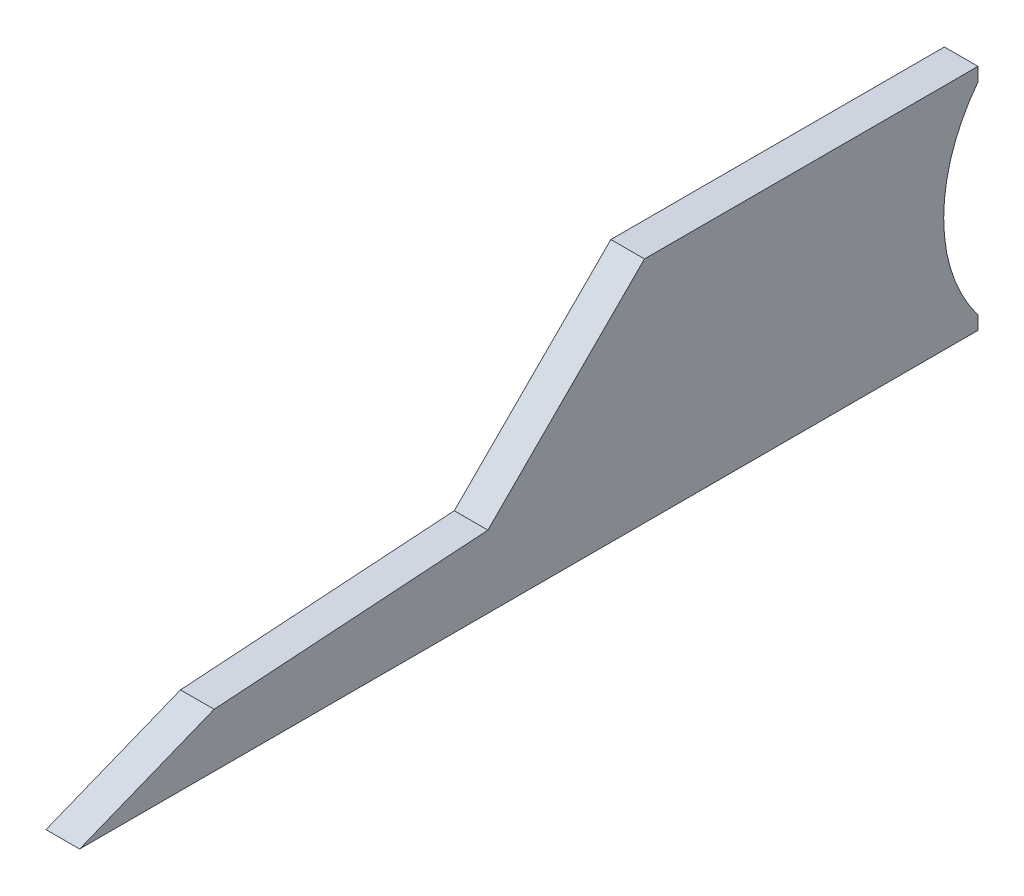
ISO-10303-21;
HEADER;
FILE_DESCRIPTION(('STEP AP214'),'2;1');
FILE_NAME('part.step','',(''),(''),'','','');
FILE_SCHEMA(('AUTOMOTIVE_DESIGN { 1 0 10303 214 1 1 1 1 }'));
ENDSEC;
DATA;
#1=APPLICATION_CONTEXT('core data for automotive mechanical design processes');
#2=APPLICATION_PROTOCOL_DEFINITION('international standard','automotive_design',2000,#1);
#3=PRODUCT_CONTEXT('',#1,'mechanical');
#4=PRODUCT('Part','Part','',(#3));
#5=PRODUCT_RELATED_PRODUCT_CATEGORY('part','',(#4));
#6=PRODUCT_DEFINITION_FORMATION('','',#4);
#7=PRODUCT_DEFINITION_CONTEXT('part definition',#1,'design');
#8=PRODUCT_DEFINITION('design','',#6,#7);
#9=PRODUCT_DEFINITION_SHAPE('','',#8);
#10=(LENGTH_UNIT() NAMED_UNIT(*) SI_UNIT(.MILLI.,.METRE.));
#11=(NAMED_UNIT(*) PLANE_ANGLE_UNIT() SI_UNIT($,.RADIAN.));
#12=(NAMED_UNIT(*) SI_UNIT($,.STERADIAN.) SOLID_ANGLE_UNIT());
#13=UNCERTAINTY_MEASURE_WITH_UNIT(LENGTH_MEASURE(1.E-05),#10,'distance_accuracy_value','');
#14=(GEOMETRIC_REPRESENTATION_CONTEXT(3) GLOBAL_UNCERTAINTY_ASSIGNED_CONTEXT((#13)) GLOBAL_UNIT_ASSIGNED_CONTEXT((#10,
#11,#12)) REPRESENTATION_CONTEXT('',''));
#15=CARTESIAN_POINT('',(0.,0.,0.));
#16=DIRECTION('',(0.,0.,1.));
#17=DIRECTION('',(1.,0.,0.));
#18=AXIS2_PLACEMENT_3D('',#15,#16,#17);
#19=CARTESIAN_POINT('',(6.35,0.,0.));
#20=DIRECTION('',(0.,0.,1.));
#21=DIRECTION('',(0.,-1.,0.));
#22=AXIS2_PLACEMENT_3D('',#19,#20,#21);
#23=PLANE('',#22);
#24=DIRECTION('',(0.,1.,0.));
#25=VECTOR('',#24,1.);
#26=CARTESIAN_POINT('',(0.,0.,0.));
#27=LINE('',#26,#25);
#28=CARTESIAN_POINT('',(0.,0.,0.));
#29=VERTEX_POINT('',#28);
#30=CARTESIAN_POINT('',(0.,2.54,0.));
#31=VERTEX_POINT('',#30);
#32=EDGE_CURVE('E125',#29,#31,#27,.T.);
#33=ORIENTED_EDGE('',*,*,#32,.T.);
#34=DIRECTION('',(-1.,0.,0.));
#35=VECTOR('',#34,1.);
#36=CARTESIAN_POINT('',(6.35,2.54,0.));
#37=LINE('',#36,#35);
#38=CARTESIAN_POINT('',(6.35,2.54,0.));
#39=VERTEX_POINT('',#38);
#40=EDGE_CURVE('E11',#39,#31,#37,.T.);
#41=ORIENTED_EDGE('',*,*,#40,.F.);
#42=DIRECTION('',(0.,1.,0.));
#43=VECTOR('',#42,1.);
#44=CARTESIAN_POINT('',(6.35,0.,0.));
#45=LINE('',#44,#43);
#46=CARTESIAN_POINT('',(6.35,0.,0.));
#47=VERTEX_POINT('',#46);
#48=EDGE_CURVE('E126',#47,#39,#45,.T.);
#49=ORIENTED_EDGE('',*,*,#48,.F.);
#50=DIRECTION('',(-1.,0.,0.));
#51=VECTOR('',#50,1.);
#52=CARTESIAN_POINT('',(6.35,0.,0.));
#53=LINE('',#52,#51);
#54=EDGE_CURVE('E139',#47,#29,#53,.T.);
#55=ORIENTED_EDGE('',*,*,#54,.T.);
#56=EDGE_LOOP('',(#33,#41,#49,#55));
#57=FACE_BOUND('',#56,.T.);
#58=ADVANCED_FACE('F33',(#57),#23,.F.);
#59=CARTESIAN_POINT('',(6.35,21.59,-24.7620690573304));
#60=DIRECTION('',(-1.,0.,0.));
#61=DIRECTION('',(0.,0.,1.));
#62=AXIS2_PLACEMENT_3D('',#59,#60,#61);
#63=CYLINDRICAL_SURFACE('',#62,31.242);
#64=CARTESIAN_POINT('',(0.,21.59,-24.7620690573304));
#65=DIRECTION('',(-1.,0.,0.));
#66=DIRECTION('',(0.,0.,-1.));
#67=AXIS2_PLACEMENT_3D('',#64,#65,#66);
#68=CIRCLE('',#67,31.242);
#69=CARTESIAN_POINT('',(0.,40.64,0.));
#70=VERTEX_POINT('',#69);
#71=EDGE_CURVE('E142',#31,#70,#68,.T.);
#72=ORIENTED_EDGE('',*,*,#71,.T.);
#73=DIRECTION('',(-1.,0.,0.));
#74=VECTOR('',#73,1.);
#75=CARTESIAN_POINT('',(6.35,40.64,0.));
#76=LINE('',#75,#74);
#77=CARTESIAN_POINT('',(6.35,40.64,0.));
#78=VERTEX_POINT('',#77);
#79=EDGE_CURVE('E40',#78,#70,#76,.T.);
#80=ORIENTED_EDGE('',*,*,#79,.F.);
#81=CARTESIAN_POINT('',(6.35,21.59,-24.7620690573304));
#82=DIRECTION('',(-1.,0.,0.));
#83=DIRECTION('',(0.,0.,-1.));
#84=AXIS2_PLACEMENT_3D('',#81,#82,#83);
#85=CIRCLE('',#84,31.242);
#86=EDGE_CURVE('E129',#39,#78,#85,.T.);
#87=ORIENTED_EDGE('',*,*,#86,.F.);
#88=ORIENTED_EDGE('',*,*,#40,.T.);
#89=EDGE_LOOP('',(#72,#80,#87,#88));
#90=FACE_BOUND('',#89,.T.);
#91=ADVANCED_FACE('F184',(#90),#63,.F.);
#92=CARTESIAN_POINT('',(6.35,40.64,0.));
#93=DIRECTION('',(0.,0.,1.));
#94=DIRECTION('',(1.,0.,0.));
#95=AXIS2_PLACEMENT_3D('',#92,#93,#94);
#96=PLANE('',#95);
#97=DIRECTION('',(0.,1.,0.));
#98=VECTOR('',#97,1.);
#99=CARTESIAN_POINT('',(0.,40.64,0.));
#100=LINE('',#99,#98);
#101=CARTESIAN_POINT('',(0.,43.18,0.));
#102=VERTEX_POINT('',#101);
#103=EDGE_CURVE('E144',#70,#102,#100,.T.);
#104=ORIENTED_EDGE('',*,*,#103,.T.);
#105=DIRECTION('',(-1.,0.,0.));
#106=VECTOR('',#105,1.);
#107=CARTESIAN_POINT('',(6.35,43.18,0.));
#108=LINE('',#107,#106);
#109=CARTESIAN_POINT('',(6.35,43.18,0.));
#110=VERTEX_POINT('',#109);
#111=EDGE_CURVE('E154',#110,#102,#108,.T.);
#112=ORIENTED_EDGE('',*,*,#111,.F.);
#113=DIRECTION('',(0.,1.,0.));
#114=VECTOR('',#113,1.);
#115=CARTESIAN_POINT('',(6.35,40.64,0.));
#116=LINE('',#115,#114);
#117=EDGE_CURVE('E132',#78,#110,#116,.T.);
#118=ORIENTED_EDGE('',*,*,#117,.F.);
#119=ORIENTED_EDGE('',*,*,#79,.T.);
#120=EDGE_LOOP('',(#104,#112,#118,#119));
#121=FACE_BOUND('',#120,.T.);
#122=ADVANCED_FACE('F161',(#121),#96,.F.);
#123=CARTESIAN_POINT('',(6.35,43.18,0.));
#124=DIRECTION('',(0.,-1.,0.));
#125=DIRECTION('',(0.,0.,-1.));
#126=AXIS2_PLACEMENT_3D('',#123,#124,#125);
#127=PLANE('',#126);
#128=DIRECTION('',(0.,0.,1.));
#129=VECTOR('',#128,1.);
#130=CARTESIAN_POINT('',(0.,43.18,0.));
#131=LINE('',#130,#129);
#132=CARTESIAN_POINT('',(0.,43.18,62.9919999999995));
#133=VERTEX_POINT('',#132);
#134=EDGE_CURVE('E146',#102,#133,#131,.T.);
#135=ORIENTED_EDGE('',*,*,#134,.T.);
#136=DIRECTION('',(-1.,0.,0.));
#137=VECTOR('',#136,1.);
#138=CARTESIAN_POINT('',(6.35,43.18,62.9919999999995));
#139=LINE('',#138,#137);
#140=CARTESIAN_POINT('',(6.35,43.18,62.9919999999995));
#141=VERTEX_POINT('',#140);
#142=EDGE_CURVE('E152',#141,#133,#139,.T.);
#143=ORIENTED_EDGE('',*,*,#142,.F.);
#144=DIRECTION('',(0.,0.,1.));
#145=VECTOR('',#144,1.);
#146=CARTESIAN_POINT('',(6.35,43.18,0.));
#147=LINE('',#146,#145);
#148=EDGE_CURVE('E134',#110,#141,#147,.T.);
#149=ORIENTED_EDGE('',*,*,#148,.F.);
#150=ORIENTED_EDGE('',*,*,#111,.T.);
#151=EDGE_LOOP('',(#135,#143,#149,#150));
#152=FACE_BOUND('',#151,.T.);
#153=ADVANCED_FACE('F170',(#152),#127,.F.);
#154=CARTESIAN_POINT('',(6.35,0.,106.172));
#155=DIRECTION('',(0.,-0.707106781186551,-0.707106781186544));
#156=DIRECTION('',(0.,0.707106781186544,-0.707106781186551));
#157=AXIS2_PLACEMENT_3D('',#154,#155,#156);
#158=PLANE('',#157);
#159=DIRECTION('',(0.,-0.707106781186544,0.707106781186551));
#160=VECTOR('',#159,1.);
#161=CARTESIAN_POINT('',(0.,0.,106.172));
#162=LINE('',#161,#160);
#163=CARTESIAN_POINT('',(0.,13.6071428571428,92.564857142857));
#164=VERTEX_POINT('',#163);
#165=EDGE_CURVE('E52',#133,#164,#162,.T.);
#166=ORIENTED_EDGE('',*,*,#165,.T.);
#167=DIRECTION('',(1.,0.,0.));
#168=VECTOR('',#167,1.);
#169=CARTESIAN_POINT('',(6.35,13.6071428571429,92.564857142857));
#170=LINE('',#169,#168);
#171=CARTESIAN_POINT('',(6.35,13.6071428571428,92.564857142857));
#172=VERTEX_POINT('',#171);
#173=EDGE_CURVE('E47',#164,#172,#170,.T.);
#174=ORIENTED_EDGE('',*,*,#173,.T.);
#175=DIRECTION('',(0.,-0.707106781186544,0.707106781186551));
#176=VECTOR('',#175,1.);
#177=CARTESIAN_POINT('',(6.35,0.,106.172));
#178=LINE('',#177,#176);
#179=EDGE_CURVE('E102',#141,#172,#178,.T.);
#180=ORIENTED_EDGE('',*,*,#179,.F.);
#181=ORIENTED_EDGE('',*,*,#142,.T.);
#182=EDGE_LOOP('',(#166,#174,#180,#181));
#183=FACE_BOUND('',#182,.T.);
#184=ADVANCED_FACE('F172',(#183),#158,.F.);
#185=CARTESIAN_POINT('',(6.35,0.,0.));
#186=DIRECTION('',(0.,1.,0.));
#187=DIRECTION('',(0.,0.,1.));
#188=AXIS2_PLACEMENT_3D('',#185,#186,#187);
#189=PLANE('',#188);
#190=ORIENTED_EDGE('',*,*,#54,.F.);
#191=DIRECTION('',(0.,0.,-1.));
#192=VECTOR('',#191,1.);
#193=CARTESIAN_POINT('',(6.35,0.,0.));
#194=LINE('',#193,#192);
#195=CARTESIAN_POINT('',(6.35,0.,169.672));
#196=VERTEX_POINT('',#195);
#197=EDGE_CURVE('E137',#196,#47,#194,.T.);
#198=ORIENTED_EDGE('',*,*,#197,.F.);
#199=DIRECTION('',(1.,0.,0.));
#200=VECTOR('',#199,1.);
#201=CARTESIAN_POINT('',(-102.736641954076,0.,169.672));
#202=LINE('',#201,#200);
#203=CARTESIAN_POINT('',(0.,0.,169.672));
#204=VERTEX_POINT('',#203);
#205=EDGE_CURVE('E113',#204,#196,#202,.T.);
#206=ORIENTED_EDGE('',*,*,#205,.F.);
#207=DIRECTION('',(0.,0.,-1.));
#208=VECTOR('',#207,1.);
#209=CARTESIAN_POINT('',(0.,0.,0.));
#210=LINE('',#209,#208);
#211=EDGE_CURVE('E130',#204,#29,#210,.T.);
#212=ORIENTED_EDGE('',*,*,#211,.T.);
#213=EDGE_LOOP('',(#190,#198,#206,#212));
#214=FACE_BOUND('',#213,.T.);
#215=ADVANCED_FACE('F174',(#214),#189,.F.);
#216=CARTESIAN_POINT('',(6.35,21.59,-24.7620690573304));
#217=DIRECTION('',(1.,0.,0.));
#218=DIRECTION('',(0.,0.,-1.));
#219=AXIS2_PLACEMENT_3D('',#216,#217,#218);
#220=PLANE('',#219);
#221=ORIENTED_EDGE('',*,*,#197,.T.);
#222=ORIENTED_EDGE('',*,*,#48,.T.);
#223=ORIENTED_EDGE('',*,*,#86,.T.);
#224=ORIENTED_EDGE('',*,*,#117,.T.);
#225=ORIENTED_EDGE('',*,*,#148,.T.);
#226=ORIENTED_EDGE('',*,*,#179,.T.);
#227=DIRECTION('',(0.,-0.0665190105237739,0.997785157856609));
#228=VECTOR('',#227,1.);
#229=CARTESIAN_POINT('',(6.35,10.16,144.272));
#230=LINE('',#229,#228);
#231=CARTESIAN_POINT('',(6.35,10.16,144.272));
#232=VERTEX_POINT('',#231);
#233=EDGE_CURVE('E97',#172,#232,#230,.T.);
#234=ORIENTED_EDGE('',*,*,#233,.T.);
#235=DIRECTION('',(0.,-0.371390676354104,0.928476690885259));
#236=VECTOR('',#235,1.);
#237=CARTESIAN_POINT('',(6.35,0.,169.672));
#238=LINE('',#237,#236);
#239=EDGE_CURVE('E101',#232,#196,#238,.T.);
#240=ORIENTED_EDGE('',*,*,#239,.T.);
#241=EDGE_LOOP('',(#221,#222,#223,#224,#225,#226,#234,#240));
#242=FACE_BOUND('',#241,.T.);
#243=ADVANCED_FACE('F99',(#242),#220,.T.);
#244=CARTESIAN_POINT('',(0.,21.59,-24.7620690573304));
#245=DIRECTION('',(1.,0.,0.));
#246=DIRECTION('',(0.,0.,-1.));
#247=AXIS2_PLACEMENT_3D('',#244,#245,#246);
#248=PLANE('',#247);
#249=ORIENTED_EDGE('',*,*,#32,.F.);
#250=ORIENTED_EDGE('',*,*,#211,.F.);
#251=DIRECTION('',(0.,0.371390676354104,-0.928476690885259));
#252=VECTOR('',#251,1.);
#253=CARTESIAN_POINT('',(0.,0.,169.672));
#254=LINE('',#253,#252);
#255=CARTESIAN_POINT('',(0.,10.16,144.272));
#256=VERTEX_POINT('',#255);
#257=EDGE_CURVE('E121',#204,#256,#254,.T.);
#258=ORIENTED_EDGE('',*,*,#257,.T.);
#259=DIRECTION('',(0.,0.0665190105237739,-0.997785157856609));
#260=VECTOR('',#259,1.);
#261=CARTESIAN_POINT('',(0.,10.16,144.272));
#262=LINE('',#261,#260);
#263=EDGE_CURVE('E110',#256,#164,#262,.T.);
#264=ORIENTED_EDGE('',*,*,#263,.T.);
#265=ORIENTED_EDGE('',*,*,#165,.F.);
#266=ORIENTED_EDGE('',*,*,#134,.F.);
#267=ORIENTED_EDGE('',*,*,#103,.F.);
#268=ORIENTED_EDGE('',*,*,#71,.F.);
#269=EDGE_LOOP('',(#249,#250,#258,#264,#265,#266,#267,#268));
#270=FACE_BOUND('',#269,.T.);
#271=ADVANCED_FACE('F167',(#270),#248,.F.);
#272=CARTESIAN_POINT('',(-102.736641954076,10.16,144.272));
#273=DIRECTION('',(0.,0.997785157856609,0.0665190105237739));
#274=DIRECTION('',(0.,-0.0665190105237739,0.997785157856609));
#275=AXIS2_PLACEMENT_3D('',#272,#273,#274);
#276=PLANE('',#275);
#277=ORIENTED_EDGE('',*,*,#173,.F.);
#278=ORIENTED_EDGE('',*,*,#263,.F.);
#279=DIRECTION('',(1.,0.,0.));
#280=VECTOR('',#279,1.);
#281=CARTESIAN_POINT('',(-102.736641954076,10.16,144.272));
#282=LINE('',#281,#280);
#283=EDGE_CURVE('E107',#256,#232,#282,.T.);
#284=ORIENTED_EDGE('',*,*,#283,.T.);
#285=ORIENTED_EDGE('',*,*,#233,.F.);
#286=EDGE_LOOP('',(#277,#278,#284,#285));
#287=FACE_BOUND('',#286,.T.);
#288=ADVANCED_FACE('F108',(#287),#276,.T.);
#289=CARTESIAN_POINT('',(-102.736641954076,0.,169.672));
#290=DIRECTION('',(0.,0.928476690885259,0.371390676354104));
#291=DIRECTION('',(0.,-0.371390676354104,0.928476690885259));
#292=AXIS2_PLACEMENT_3D('',#289,#290,#291);
#293=PLANE('',#292);
#294=ORIENTED_EDGE('',*,*,#257,.F.);
#295=ORIENTED_EDGE('',*,*,#205,.T.);
#296=ORIENTED_EDGE('',*,*,#239,.F.);
#297=ORIENTED_EDGE('',*,*,#283,.F.);
#298=EDGE_LOOP('',(#294,#295,#296,#297));
#299=FACE_BOUND('',#298,.T.);
#300=ADVANCED_FACE('F116',(#299),#293,.T.);
#301=CLOSED_SHELL('',(#58,#91,#122,#153,#184,#215,#243,#271,#288,#300));
#302=MANIFOLD_SOLID_BREP('B2',#301);
#303=ADVANCED_BREP_SHAPE_REPRESENTATION('',(#18,#302),#14);
#304=SHAPE_DEFINITION_REPRESENTATION(#9,#303);
ENDSEC;
END-ISO-10303-21;
